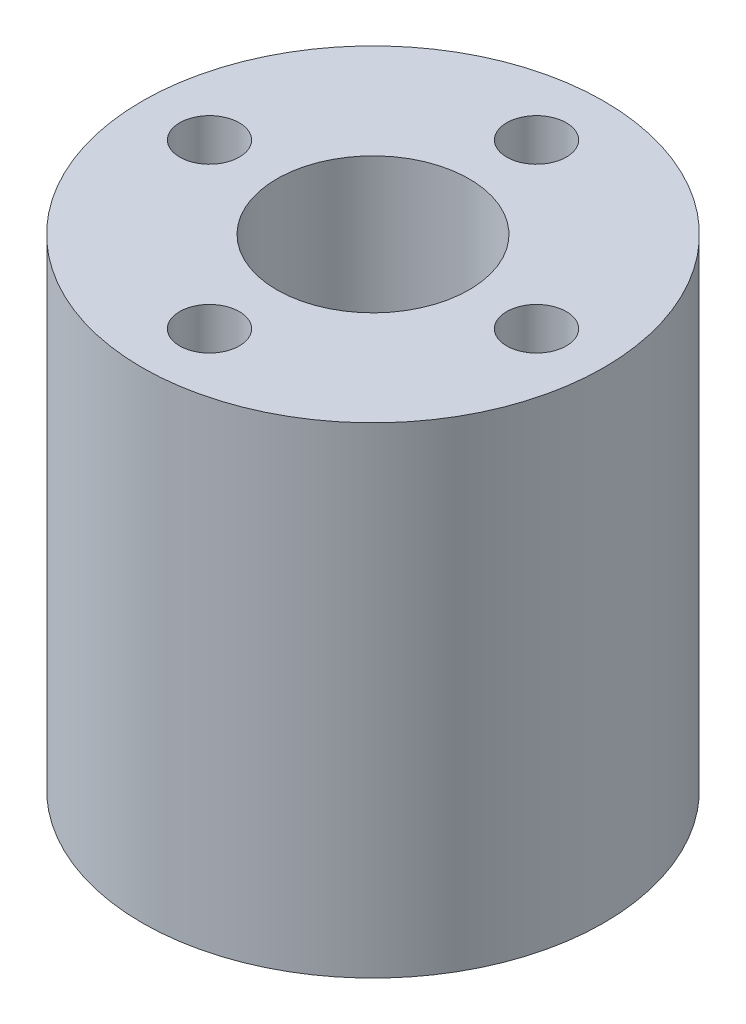
ISO-10303-21;
HEADER;
FILE_DESCRIPTION(('STEP AP214'),'2;1');
FILE_NAME('part.step','',(''),(''),'','','');
FILE_SCHEMA(('AUTOMOTIVE_DESIGN { 1 0 10303 214 1 1 1 1 }'));
ENDSEC;
DATA;
#1=APPLICATION_CONTEXT('core data for automotive mechanical design processes');
#2=APPLICATION_PROTOCOL_DEFINITION('international standard','automotive_design',2000,#1);
#3=PRODUCT_CONTEXT('',#1,'mechanical');
#4=PRODUCT('Part','Part','',(#3));
#5=PRODUCT_RELATED_PRODUCT_CATEGORY('part','',(#4));
#6=PRODUCT_DEFINITION_FORMATION('','',#4);
#7=PRODUCT_DEFINITION_CONTEXT('part definition',#1,'design');
#8=PRODUCT_DEFINITION('design','',#6,#7);
#9=PRODUCT_DEFINITION_SHAPE('','',#8);
#10=(LENGTH_UNIT() NAMED_UNIT(*) SI_UNIT(.MILLI.,.METRE.));
#11=(NAMED_UNIT(*) PLANE_ANGLE_UNIT() SI_UNIT($,.RADIAN.));
#12=(NAMED_UNIT(*) SI_UNIT($,.STERADIAN.) SOLID_ANGLE_UNIT());
#13=UNCERTAINTY_MEASURE_WITH_UNIT(LENGTH_MEASURE(1.E-05),#10,'distance_accuracy_value','');
#14=(GEOMETRIC_REPRESENTATION_CONTEXT(3) GLOBAL_UNCERTAINTY_ASSIGNED_CONTEXT((#13)) GLOBAL_UNIT_ASSIGNED_CONTEXT((#10,
#11,#12)) REPRESENTATION_CONTEXT('',''));
#15=CARTESIAN_POINT('',(0.,0.,0.));
#16=DIRECTION('',(0.,0.,1.));
#17=DIRECTION('',(1.,0.,0.));
#18=AXIS2_PLACEMENT_3D('',#15,#16,#17);
#19=CARTESIAN_POINT('',(0.,25.,0.));
#20=DIRECTION('',(0.,1.,0.));
#21=DIRECTION('',(0.,0.,1.));
#22=AXIS2_PLACEMENT_3D('',#19,#20,#21);
#23=PLANE('',#22);
#24=CARTESIAN_POINT('',(4.81087160758318E-13,25.,8.5));
#25=DIRECTION('',(0.,1.,0.));
#26=DIRECTION('',(0.,0.,1.));
#27=AXIS2_PLACEMENT_3D('',#24,#25,#26);
#28=CIRCLE('',#27,1.55000000000052);
#29=CARTESIAN_POINT('',(4.81087160758318E-13,25.,10.0500000000005));
#30=VERTEX_POINT('',#29);
#31=EDGE_CURVE('E72',#30,#30,#28,.T.);
#32=ORIENTED_EDGE('',*,*,#31,.F.);
#33=EDGE_LOOP('',(#32));
#34=FACE_BOUND('',#33,.T.);
#35=CARTESIAN_POINT('',(0.,25.,0.));
#36=DIRECTION('',(0.,1.,0.));
#37=DIRECTION('',(0.,0.,1.));
#38=AXIS2_PLACEMENT_3D('',#35,#36,#37);
#39=CIRCLE('',#38,5.);
#40=CARTESIAN_POINT('',(0.,25.,5.));
#41=VERTEX_POINT('',#40);
#42=EDGE_CURVE('E56',#41,#41,#39,.T.);
#43=ORIENTED_EDGE('',*,*,#42,.F.);
#44=EDGE_LOOP('',(#43));
#45=FACE_BOUND('',#44,.T.);
#46=CARTESIAN_POINT('',(0.,25.,0.));
#47=DIRECTION('',(0.,1.,0.));
#48=DIRECTION('',(0.,0.,1.));
#49=AXIS2_PLACEMENT_3D('',#46,#47,#48);
#50=CIRCLE('',#49,12.);
#51=CARTESIAN_POINT('',(0.,25.,12.));
#52=VERTEX_POINT('',#51);
#53=EDGE_CURVE('E10',#52,#52,#50,.T.);
#54=ORIENTED_EDGE('',*,*,#53,.T.);
#55=EDGE_LOOP('',(#54));
#56=FACE_BOUND('',#55,.T.);
#57=CARTESIAN_POINT('',(0.,25.,-8.5));
#58=DIRECTION('',(0.,1.,0.));
#59=DIRECTION('',(0.,0.,1.));
#60=AXIS2_PLACEMENT_3D('',#57,#58,#59);
#61=CIRCLE('',#60,1.55);
#62=CARTESIAN_POINT('',(0.,25.,-6.95));
#63=VERTEX_POINT('',#62);
#64=EDGE_CURVE('E50',#63,#63,#61,.T.);
#65=ORIENTED_EDGE('',*,*,#64,.F.);
#66=EDGE_LOOP('',(#65));
#67=FACE_BOUND('',#66,.T.);
#68=CARTESIAN_POINT('',(8.50000000000024,25.,-2.40543580379159E-13));
#69=DIRECTION('',(0.,1.,0.));
#70=DIRECTION('',(0.,0.,1.));
#71=AXIS2_PLACEMENT_3D('',#68,#69,#70);
#72=CIRCLE('',#71,1.55000000000019);
#73=CARTESIAN_POINT('',(8.50000000000024,25.,1.54999999999995));
#74=VERTEX_POINT('',#73);
#75=EDGE_CURVE('E64',#74,#74,#72,.T.);
#76=ORIENTED_EDGE('',*,*,#75,.F.);
#77=EDGE_LOOP('',(#76));
#78=FACE_BOUND('',#77,.T.);
#79=CARTESIAN_POINT('',(-8.49999999999976,25.,2.41584530158434E-13));
#80=DIRECTION('',(0.,1.,0.));
#81=DIRECTION('',(0.,0.,1.));
#82=AXIS2_PLACEMENT_3D('',#79,#80,#81);
#83=CIRCLE('',#82,1.55000000000039);
#84=CARTESIAN_POINT('',(-8.49999999999976,25.,1.55000000000063));
#85=VERTEX_POINT('',#84);
#86=EDGE_CURVE('E80',#85,#85,#83,.T.);
#87=ORIENTED_EDGE('',*,*,#86,.F.);
#88=EDGE_LOOP('',(#87));
#89=FACE_BOUND('',#88,.T.);
#90=ADVANCED_FACE('F37',(#34,#45,#56,#67,#78,#89),#23,.T.);
#91=CARTESIAN_POINT('',(0.,0.,0.));
#92=DIRECTION('',(0.,1.,0.));
#93=DIRECTION('',(0.,0.,1.));
#94=AXIS2_PLACEMENT_3D('',#91,#92,#93);
#95=PLANE('',#94);
#96=CARTESIAN_POINT('',(0.,0.,0.));
#97=DIRECTION('',(0.,1.,0.));
#98=DIRECTION('',(0.,0.,1.));
#99=AXIS2_PLACEMENT_3D('',#96,#97,#98);
#100=CIRCLE('',#99,12.);
#101=CARTESIAN_POINT('',(0.,0.,12.));
#102=VERTEX_POINT('',#101);
#103=EDGE_CURVE('E41',#102,#102,#100,.T.);
#104=ORIENTED_EDGE('',*,*,#103,.F.);
#105=EDGE_LOOP('',(#104));
#106=FACE_BOUND('',#105,.T.);
#107=CARTESIAN_POINT('',(0.,0.,-8.5));
#108=DIRECTION('',(0.,1.,0.));
#109=DIRECTION('',(0.,0.,1.));
#110=AXIS2_PLACEMENT_3D('',#107,#108,#109);
#111=CIRCLE('',#110,1.55);
#112=CARTESIAN_POINT('',(0.,0.,-6.95));
#113=VERTEX_POINT('',#112);
#114=EDGE_CURVE('E52',#113,#113,#111,.T.);
#115=ORIENTED_EDGE('',*,*,#114,.T.);
#116=EDGE_LOOP('',(#115));
#117=FACE_BOUND('',#116,.T.);
#118=CARTESIAN_POINT('',(0.,0.,0.));
#119=DIRECTION('',(0.,1.,0.));
#120=DIRECTION('',(0.,0.,1.));
#121=AXIS2_PLACEMENT_3D('',#118,#119,#120);
#122=CIRCLE('',#121,5.);
#123=CARTESIAN_POINT('',(0.,0.,5.));
#124=VERTEX_POINT('',#123);
#125=EDGE_CURVE('E60',#124,#124,#122,.T.);
#126=ORIENTED_EDGE('',*,*,#125,.T.);
#127=EDGE_LOOP('',(#126));
#128=FACE_BOUND('',#127,.T.);
#129=CARTESIAN_POINT('',(8.50000000000024,0.,-2.40543580379159E-13));
#130=DIRECTION('',(0.,1.,0.));
#131=DIRECTION('',(0.,0.,1.));
#132=AXIS2_PLACEMENT_3D('',#129,#130,#131);
#133=CIRCLE('',#132,1.55000000000019);
#134=CARTESIAN_POINT('',(8.50000000000024,0.,1.54999999999995));
#135=VERTEX_POINT('',#134);
#136=EDGE_CURVE('E68',#135,#135,#133,.T.);
#137=ORIENTED_EDGE('',*,*,#136,.T.);
#138=EDGE_LOOP('',(#137));
#139=FACE_BOUND('',#138,.T.);
#140=CARTESIAN_POINT('',(4.81087160758318E-13,0.,8.5));
#141=DIRECTION('',(0.,1.,0.));
#142=DIRECTION('',(0.,0.,1.));
#143=AXIS2_PLACEMENT_3D('',#140,#141,#142);
#144=CIRCLE('',#143,1.55000000000052);
#145=CARTESIAN_POINT('',(4.81087160758318E-13,0.,10.0500000000005));
#146=VERTEX_POINT('',#145);
#147=EDGE_CURVE('E76',#146,#146,#144,.T.);
#148=ORIENTED_EDGE('',*,*,#147,.T.);
#149=EDGE_LOOP('',(#148));
#150=FACE_BOUND('',#149,.T.);
#151=CARTESIAN_POINT('',(-8.49999999999976,0.,2.41584530158434E-13));
#152=DIRECTION('',(0.,1.,0.));
#153=DIRECTION('',(0.,0.,1.));
#154=AXIS2_PLACEMENT_3D('',#151,#152,#153);
#155=CIRCLE('',#154,1.55000000000039);
#156=CARTESIAN_POINT('',(-8.49999999999976,0.,1.55000000000063));
#157=VERTEX_POINT('',#156);
#158=EDGE_CURVE('E84',#157,#157,#155,.T.);
#159=ORIENTED_EDGE('',*,*,#158,.T.);
#160=EDGE_LOOP('',(#159));
#161=FACE_BOUND('',#160,.T.);
#162=ADVANCED_FACE('F96',(#106,#117,#128,#139,#150,#161),#95,.F.);
#163=CARTESIAN_POINT('',(0.,25.,0.));
#164=DIRECTION('',(0.,-1.,0.));
#165=DIRECTION('',(0.,0.,-1.));
#166=AXIS2_PLACEMENT_3D('',#163,#164,#165);
#167=CYLINDRICAL_SURFACE('',#166,12.);
#168=ORIENTED_EDGE('',*,*,#53,.F.);
#169=EDGE_LOOP('',(#168));
#170=FACE_BOUND('',#169,.T.);
#171=ORIENTED_EDGE('',*,*,#103,.T.);
#172=EDGE_LOOP('',(#171));
#173=FACE_BOUND('',#172,.T.);
#174=ADVANCED_FACE('F39',(#170,#173),#167,.T.);
#175=CARTESIAN_POINT('',(0.,25.,-8.5));
#176=DIRECTION('',(0.,-1.,0.));
#177=DIRECTION('',(0.,0.,-1.));
#178=AXIS2_PLACEMENT_3D('',#175,#176,#177);
#179=CYLINDRICAL_SURFACE('',#178,1.55);
#180=ORIENTED_EDGE('',*,*,#64,.T.);
#181=EDGE_LOOP('',(#180));
#182=FACE_BOUND('',#181,.T.);
#183=ORIENTED_EDGE('',*,*,#114,.F.);
#184=EDGE_LOOP('',(#183));
#185=FACE_BOUND('',#184,.T.);
#186=ADVANCED_FACE('F106',(#182,#185),#179,.F.);
#187=CARTESIAN_POINT('',(0.,25.,0.));
#188=DIRECTION('',(0.,-1.,0.));
#189=DIRECTION('',(0.,0.,-1.));
#190=AXIS2_PLACEMENT_3D('',#187,#188,#189);
#191=CYLINDRICAL_SURFACE('',#190,5.);
#192=ORIENTED_EDGE('',*,*,#42,.T.);
#193=EDGE_LOOP('',(#192));
#194=FACE_BOUND('',#193,.T.);
#195=ORIENTED_EDGE('',*,*,#125,.F.);
#196=EDGE_LOOP('',(#195));
#197=FACE_BOUND('',#196,.T.);
#198=ADVANCED_FACE('F109',(#194,#197),#191,.F.);
#199=CARTESIAN_POINT('',(8.50000000000024,25.,-2.40543580379159E-13));
#200=DIRECTION('',(0.,-1.,0.));
#201=DIRECTION('',(0.,0.,-1.));
#202=AXIS2_PLACEMENT_3D('',#199,#200,#201);
#203=CYLINDRICAL_SURFACE('',#202,1.55000000000019);
#204=ORIENTED_EDGE('',*,*,#75,.T.);
#205=EDGE_LOOP('',(#204));
#206=FACE_BOUND('',#205,.T.);
#207=ORIENTED_EDGE('',*,*,#136,.F.);
#208=EDGE_LOOP('',(#207));
#209=FACE_BOUND('',#208,.T.);
#210=ADVANCED_FACE('F113',(#206,#209),#203,.F.);
#211=CARTESIAN_POINT('',(4.81087160758318E-13,25.,8.5));
#212=DIRECTION('',(0.,-1.,0.));
#213=DIRECTION('',(0.,0.,-1.));
#214=AXIS2_PLACEMENT_3D('',#211,#212,#213);
#215=CYLINDRICAL_SURFACE('',#214,1.55000000000052);
#216=ORIENTED_EDGE('',*,*,#31,.T.);
#217=EDGE_LOOP('',(#216));
#218=FACE_BOUND('',#217,.T.);
#219=ORIENTED_EDGE('',*,*,#147,.F.);
#220=EDGE_LOOP('',(#219));
#221=FACE_BOUND('',#220,.T.);
#222=ADVANCED_FACE('F117',(#218,#221),#215,.F.);
#223=CARTESIAN_POINT('',(-8.49999999999976,25.,2.41584530158434E-13));
#224=DIRECTION('',(0.,-1.,0.));
#225=DIRECTION('',(0.,0.,-1.));
#226=AXIS2_PLACEMENT_3D('',#223,#224,#225);
#227=CYLINDRICAL_SURFACE('',#226,1.55000000000039);
#228=ORIENTED_EDGE('',*,*,#86,.T.);
#229=EDGE_LOOP('',(#228));
#230=FACE_BOUND('',#229,.T.);
#231=ORIENTED_EDGE('',*,*,#158,.F.);
#232=EDGE_LOOP('',(#231));
#233=FACE_BOUND('',#232,.T.);
#234=ADVANCED_FACE('F92',(#230,#233),#227,.F.);
#235=CLOSED_SHELL('',(#90,#162,#174,#186,#198,#210,#222,#234));
#236=MANIFOLD_SOLID_BREP('B2',#235);
#237=ADVANCED_BREP_SHAPE_REPRESENTATION('',(#18,#236),#14);
#238=SHAPE_DEFINITION_REPRESENTATION(#9,#237);
ENDSEC;
END-ISO-10303-21;
